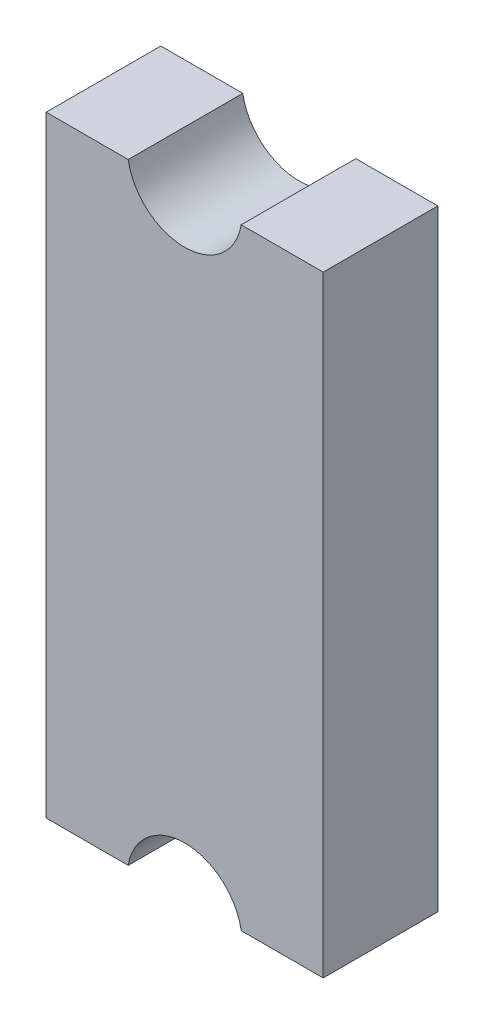
ISO-10303-21;
HEADER;
FILE_DESCRIPTION(('STEP AP214'),'2;1');
FILE_NAME('part.step','',(''),(''),'','','');
FILE_SCHEMA(('AUTOMOTIVE_DESIGN { 1 0 10303 214 1 1 1 1 }'));
ENDSEC;
DATA;
#1=APPLICATION_CONTEXT('core data for automotive mechanical design processes');
#2=APPLICATION_PROTOCOL_DEFINITION('international standard','automotive_design',2000,#1);
#3=PRODUCT_CONTEXT('',#1,'mechanical');
#4=PRODUCT('Part','Part','',(#3));
#5=PRODUCT_RELATED_PRODUCT_CATEGORY('part','',(#4));
#6=PRODUCT_DEFINITION_FORMATION('','',#4);
#7=PRODUCT_DEFINITION_CONTEXT('part definition',#1,'design');
#8=PRODUCT_DEFINITION('design','',#6,#7);
#9=PRODUCT_DEFINITION_SHAPE('','',#8);
#10=(LENGTH_UNIT() NAMED_UNIT(*) SI_UNIT(.MILLI.,.METRE.));
#11=(NAMED_UNIT(*) PLANE_ANGLE_UNIT() SI_UNIT($,.RADIAN.));
#12=(NAMED_UNIT(*) SI_UNIT($,.STERADIAN.) SOLID_ANGLE_UNIT());
#13=UNCERTAINTY_MEASURE_WITH_UNIT(LENGTH_MEASURE(1.E-05),#10,'distance_accuracy_value','');
#14=(GEOMETRIC_REPRESENTATION_CONTEXT(3) GLOBAL_UNCERTAINTY_ASSIGNED_CONTEXT((#13)) GLOBAL_UNIT_ASSIGNED_CONTEXT((#10,
#11,#12)) REPRESENTATION_CONTEXT('',''));
#15=CARTESIAN_POINT('',(0.,0.,0.));
#16=DIRECTION('',(0.,0.,1.));
#17=DIRECTION('',(1.,0.,0.));
#18=AXIS2_PLACEMENT_3D('',#15,#16,#17);
#19=CARTESIAN_POINT('',(-0.00667937524977396,-0.771801987569789,0.412208026250708));
#20=DIRECTION('',(0.,0.,1.));
#21=DIRECTION('',(1.,0.,0.));
#22=AXIS2_PLACEMENT_3D('',#19,#20,#21);
#23=PLANE('',#22);
#24=DIRECTION('',(0.,-1.,0.));
#25=VECTOR('',#24,1.);
#26=CARTESIAN_POINT('',(-0.459804375249889,-0.771801987569789,0.412208026250708));
#27=LINE('',#26,#25);
#28=CARTESIAN_POINT('',(-0.459804375249889,0.228198012430198,0.412208026250708));
#29=VERTEX_POINT('',#28);
#30=CARTESIAN_POINT('',(-0.459804375249822,-1.77180198756978,0.412208026250708));
#31=VERTEX_POINT('',#30);
#32=EDGE_CURVE('E11',#29,#31,#27,.T.);
#33=ORIENTED_EDGE('',*,*,#32,.T.);
#34=DIRECTION('',(1.,0.,0.));
#35=VECTOR('',#34,1.);
#36=CARTESIAN_POINT('',(-0.00667937524977396,-1.77180198756978,0.412208026250708));
#37=LINE('',#36,#35);
#38=CARTESIAN_POINT('',(-0.19155686847158,-1.77180198756976,0.412208026250708));
#39=VERTEX_POINT('',#38);
#40=EDGE_CURVE('E24',#31,#39,#37,.T.);
#41=ORIENTED_EDGE('',*,*,#40,.T.);
#42=CARTESIAN_POINT('',(-0.0066793752496696,-1.80305198756974,0.412208026250708));
#43=DIRECTION('',(0.,0.,-1.));
#44=DIRECTION('',(1.,0.,0.));
#45=AXIS2_PLACEMENT_3D('',#42,#43,#44);
#46=CIRCLE('',#45,0.187500000000043);
#47=CARTESIAN_POINT('',(0.178198117972232,-1.77180198756971,0.412208026250708));
#48=VERTEX_POINT('',#47);
#49=EDGE_CURVE('E141',#39,#48,#46,.T.);
#50=ORIENTED_EDGE('',*,*,#49,.T.);
#51=DIRECTION('',(1.,0.,0.));
#52=VECTOR('',#51,1.);
#53=CARTESIAN_POINT('',(-0.00667937524977396,-1.77180198756971,0.412208026250708));
#54=LINE('',#53,#52);
#55=CARTESIAN_POINT('',(0.446445624750341,-1.7718019875697,0.412208026250708));
#56=VERTEX_POINT('',#55);
#57=EDGE_CURVE('E83',#48,#56,#54,.T.);
#58=ORIENTED_EDGE('',*,*,#57,.T.);
#59=DIRECTION('',(0.,1.,0.));
#60=VECTOR('',#59,1.);
#61=CARTESIAN_POINT('',(0.446445624750342,-0.771801987569789,0.412208026250708));
#62=LINE('',#61,#60);
#63=CARTESIAN_POINT('',(0.446445624750274,0.228198012430271,0.412208026250708));
#64=VERTEX_POINT('',#63);
#65=EDGE_CURVE('E138',#56,#64,#62,.T.);
#66=ORIENTED_EDGE('',*,*,#65,.T.);
#67=DIRECTION('',(-1.,0.,0.));
#68=VECTOR('',#67,1.);
#69=CARTESIAN_POINT('',(-0.00667937524977396,0.228198012430271,0.412208026250708));
#70=LINE('',#69,#68);
#71=CARTESIAN_POINT('',(0.178198117972032,0.228198012430258,0.412208026250708));
#72=VERTEX_POINT('',#71);
#73=EDGE_CURVE('E136',#64,#72,#70,.T.);
#74=ORIENTED_EDGE('',*,*,#73,.T.);
#75=CARTESIAN_POINT('',(-0.00667937524987831,0.259448012430233,0.412208026250708));
#76=DIRECTION('',(0.,0.,-1.));
#77=DIRECTION('',(-1.,0.,0.));
#78=AXIS2_PLACEMENT_3D('',#75,#76,#77);
#79=CIRCLE('',#78,0.187500000000043);
#80=CARTESIAN_POINT('',(-0.19155686847178,0.228198012430207,0.412208026250708));
#81=VERTEX_POINT('',#80);
#82=EDGE_CURVE('E134',#72,#81,#79,.T.);
#83=ORIENTED_EDGE('',*,*,#82,.T.);
#84=DIRECTION('',(-1.,0.,0.));
#85=VECTOR('',#84,1.);
#86=CARTESIAN_POINT('',(-0.00667937524977396,0.228198012430207,0.412208026250708));
#87=LINE('',#86,#85);
#88=EDGE_CURVE('E132',#81,#29,#87,.T.);
#89=ORIENTED_EDGE('',*,*,#88,.T.);
#90=EDGE_LOOP('',(#33,#41,#50,#58,#66,#74,#83,#89));
#91=FACE_BOUND('',#90,.T.);
#92=ADVANCED_FACE('F17',(#91),#23,.T.);
#93=CARTESIAN_POINT('',(0.446445624750342,-1.77180198756969,0.0372080262507079));
#94=DIRECTION('',(1.01196828694583E-13,-1.,0.));
#95=DIRECTION('',(1.,1.01196828694583E-13,0.));
#96=AXIS2_PLACEMENT_3D('',#93,#94,#95);
#97=PLANE('',#96);
#98=DIRECTION('',(0.,0.,1.));
#99=VECTOR('',#98,1.);
#100=CARTESIAN_POINT('',(-0.191556868471578,-1.77180198756975,0.0372080262507079));
#101=LINE('',#100,#99);
#102=CARTESIAN_POINT('',(-0.19155686847158,-1.77180198756976,0.0372080262507079));
#103=VERTEX_POINT('',#102);
#104=EDGE_CURVE('E101',#103,#39,#101,.T.);
#105=ORIENTED_EDGE('',*,*,#104,.T.);
#106=ORIENTED_EDGE('',*,*,#40,.F.);
#107=DIRECTION('',(0.,0.,-1.));
#108=VECTOR('',#107,1.);
#109=CARTESIAN_POINT('',(-0.459804375249687,-1.77180198756978,0.0372080262507079));
#110=LINE('',#109,#108);
#111=CARTESIAN_POINT('',(-0.459804375249754,-1.77180198756978,0.0372080262507079));
#112=VERTEX_POINT('',#111);
#113=EDGE_CURVE('E129',#31,#112,#110,.T.);
#114=ORIENTED_EDGE('',*,*,#113,.T.);
#115=DIRECTION('',(1.,0.,0.));
#116=VECTOR('',#115,1.);
#117=CARTESIAN_POINT('',(-0.00667937524977396,-1.77180198756978,0.0372080262507079));
#118=LINE('',#117,#116);
#119=EDGE_CURVE('E127',#112,#103,#118,.T.);
#120=ORIENTED_EDGE('',*,*,#119,.T.);
#121=EDGE_LOOP('',(#105,#106,#114,#120));
#122=FACE_BOUND('',#121,.T.);
#123=ADVANCED_FACE('F143',(#122),#97,.T.);
#124=CARTESIAN_POINT('',(-0.459804375249889,0.22819801243018,0.0372080262507079));
#125=DIRECTION('',(-1.,-1.01196828694583E-13,0.));
#126=DIRECTION('',(1.01196828694583E-13,-1.,0.));
#127=AXIS2_PLACEMENT_3D('',#124,#125,#126);
#128=PLANE('',#127);
#129=ORIENTED_EDGE('',*,*,#32,.F.);
#130=DIRECTION('',(0.,0.,-1.));
#131=VECTOR('',#130,1.);
#132=CARTESIAN_POINT('',(-0.459804375249889,0.22819801243018,0.0372080262507079));
#133=LINE('',#132,#131);
#134=CARTESIAN_POINT('',(-0.459804375249889,0.22819801243018,0.0372080262507079));
#135=VERTEX_POINT('',#134);
#136=EDGE_CURVE('E125',#29,#135,#133,.T.);
#137=ORIENTED_EDGE('',*,*,#136,.T.);
#138=DIRECTION('',(1.01196828694583E-13,-1.,0.));
#139=VECTOR('',#138,1.);
#140=CARTESIAN_POINT('',(-0.459804375249889,0.22819801243018,0.037208026250708));
#141=LINE('',#140,#139);
#142=EDGE_CURVE('E122',#135,#112,#141,.T.);
#143=ORIENTED_EDGE('',*,*,#142,.T.);
#144=ORIENTED_EDGE('',*,*,#113,.F.);
#145=EDGE_LOOP('',(#129,#137,#143,#144));
#146=FACE_BOUND('',#145,.T.);
#147=ADVANCED_FACE('F146',(#146),#128,.T.);
#148=CARTESIAN_POINT('',(0.446445624750139,0.228198012430271,0.0372080262507079));
#149=DIRECTION('',(-1.01196828694583E-13,1.,0.));
#150=DIRECTION('',(-1.,-1.01196828694583E-13,0.));
#151=AXIS2_PLACEMENT_3D('',#148,#149,#150);
#152=PLANE('',#151);
#153=DIRECTION('',(0.,0.,-1.));
#154=VECTOR('',#153,1.);
#155=CARTESIAN_POINT('',(-0.19155686847178,0.228198012430207,0.0372080262507079));
#156=LINE('',#155,#154);
#157=CARTESIAN_POINT('',(-0.19155686847178,0.228198012430207,0.0372080262507079));
#158=VERTEX_POINT('',#157);
#159=EDGE_CURVE('E120',#81,#158,#156,.T.);
#160=ORIENTED_EDGE('',*,*,#159,.T.);
#161=DIRECTION('',(-1.,-1.01196828694583E-13,0.));
#162=VECTOR('',#161,1.);
#163=CARTESIAN_POINT('',(0.446445624750139,0.228198012430271,0.0372080262507079));
#164=LINE('',#163,#162);
#165=EDGE_CURVE('E117',#158,#135,#164,.T.);
#166=ORIENTED_EDGE('',*,*,#165,.T.);
#167=ORIENTED_EDGE('',*,*,#136,.F.);
#168=ORIENTED_EDGE('',*,*,#88,.F.);
#169=EDGE_LOOP('',(#160,#166,#167,#168));
#170=FACE_BOUND('',#169,.T.);
#171=ADVANCED_FACE('F150',(#170),#152,.T.);
#172=CARTESIAN_POINT('',(-0.00667937524987831,0.259448012430233,-0.276759193103288));
#173=DIRECTION('',(0.,0.,-1.));
#174=DIRECTION('',(-1.,0.,0.));
#175=AXIS2_PLACEMENT_3D('',#172,#173,#174);
#176=CYLINDRICAL_SURFACE('',#175,0.187500000000043);
#177=ORIENTED_EDGE('',*,*,#159,.F.);
#178=ORIENTED_EDGE('',*,*,#82,.F.);
#179=DIRECTION('',(0.,0.,1.));
#180=VECTOR('',#179,1.);
#181=CARTESIAN_POINT('',(0.17819811797203,0.228198012430244,-0.276759193103288));
#182=LINE('',#181,#180);
#183=CARTESIAN_POINT('',(0.17819811797203,0.228198012430244,0.0372080262507079));
#184=VERTEX_POINT('',#183);
#185=EDGE_CURVE('E114',#184,#72,#182,.T.);
#186=ORIENTED_EDGE('',*,*,#185,.F.);
#187=CARTESIAN_POINT('',(-0.00667937524987831,0.259448012430233,0.0372080262507079));
#188=DIRECTION('',(0.,0.,1.));
#189=DIRECTION('',(-1.,0.,0.));
#190=AXIS2_PLACEMENT_3D('',#187,#188,#189);
#191=CIRCLE('',#190,0.187500000000043);
#192=EDGE_CURVE('E112',#158,#184,#191,.T.);
#193=ORIENTED_EDGE('',*,*,#192,.F.);
#194=EDGE_LOOP('',(#177,#178,#186,#193));
#195=FACE_BOUND('',#194,.T.);
#196=ADVANCED_FACE('F155',(#195),#176,.F.);
#197=CARTESIAN_POINT('',(0.446445624750139,0.228198012430271,0.0372080262507079));
#198=DIRECTION('',(-1.01196828694583E-13,1.,0.));
#199=DIRECTION('',(-1.,-1.01196828694583E-13,0.));
#200=AXIS2_PLACEMENT_3D('',#197,#198,#199);
#201=PLANE('',#200);
#202=ORIENTED_EDGE('',*,*,#185,.T.);
#203=ORIENTED_EDGE('',*,*,#73,.F.);
#204=DIRECTION('',(0.,0.,-1.));
#205=VECTOR('',#204,1.);
#206=CARTESIAN_POINT('',(0.446445624750139,0.228198012430271,0.0372080262507079));
#207=LINE('',#206,#205);
#208=CARTESIAN_POINT('',(0.446445624750139,0.228198012430271,0.037208026250708));
#209=VERTEX_POINT('',#208);
#210=EDGE_CURVE('E110',#64,#209,#207,.T.);
#211=ORIENTED_EDGE('',*,*,#210,.T.);
#212=DIRECTION('',(-1.,-1.01196828694583E-13,0.));
#213=VECTOR('',#212,1.);
#214=CARTESIAN_POINT('',(0.446445624750139,0.228198012430271,0.037208026250708));
#215=LINE('',#214,#213);
#216=EDGE_CURVE('E107',#209,#184,#215,.T.);
#217=ORIENTED_EDGE('',*,*,#216,.T.);
#218=EDGE_LOOP('',(#202,#203,#211,#217));
#219=FACE_BOUND('',#218,.T.);
#220=ADVANCED_FACE('F159',(#219),#201,.T.);
#221=CARTESIAN_POINT('',(0.446445624750342,-1.77180198756972,0.0372080262507079));
#222=DIRECTION('',(1.,1.01196828694583E-13,0.));
#223=DIRECTION('',(-1.01196828694583E-13,1.,0.));
#224=AXIS2_PLACEMENT_3D('',#221,#222,#223);
#225=PLANE('',#224);
#226=DIRECTION('',(-1.01196828694583E-13,1.,0.));
#227=VECTOR('',#226,1.);
#228=CARTESIAN_POINT('',(0.446445624750342,-1.77180198756972,0.037208026250708));
#229=LINE('',#228,#227);
#230=CARTESIAN_POINT('',(0.446445624750341,-1.77180198756969,0.0372080262507079));
#231=VERTEX_POINT('',#230);
#232=EDGE_CURVE('E96',#231,#209,#229,.T.);
#233=ORIENTED_EDGE('',*,*,#232,.T.);
#234=ORIENTED_EDGE('',*,*,#210,.F.);
#235=ORIENTED_EDGE('',*,*,#65,.F.);
#236=DIRECTION('',(0.,0.,-1.));
#237=VECTOR('',#236,1.);
#238=CARTESIAN_POINT('',(0.446445624750342,-1.77180198756969,0.0372080262507079));
#239=LINE('',#238,#237);
#240=EDGE_CURVE('E87',#56,#231,#239,.T.);
#241=ORIENTED_EDGE('',*,*,#240,.T.);
#242=EDGE_LOOP('',(#233,#234,#235,#241));
#243=FACE_BOUND('',#242,.T.);
#244=ADVANCED_FACE('F162',(#243),#225,.T.);
#245=CARTESIAN_POINT('',(0.446445624750342,-1.77180198756969,0.0372080262507079));
#246=DIRECTION('',(1.01196828694583E-13,-1.,0.));
#247=DIRECTION('',(1.,1.01196828694583E-13,0.));
#248=AXIS2_PLACEMENT_3D('',#245,#246,#247);
#249=PLANE('',#248);
#250=DIRECTION('',(0.,0.,-1.));
#251=VECTOR('',#250,1.);
#252=CARTESIAN_POINT('',(0.178198117972232,-1.77180198756971,0.0372080262507079));
#253=LINE('',#252,#251);
#254=CARTESIAN_POINT('',(0.178198117972232,-1.77180198756971,0.0372080262507079));
#255=VERTEX_POINT('',#254);
#256=EDGE_CURVE('E78',#48,#255,#253,.T.);
#257=ORIENTED_EDGE('',*,*,#256,.T.);
#258=DIRECTION('',(1.,1.01196828694583E-13,0.));
#259=VECTOR('',#258,1.);
#260=CARTESIAN_POINT('',(0.446445624750342,-1.77180198756969,0.0372080262507079));
#261=LINE('',#260,#259);
#262=EDGE_CURVE('E82',#255,#231,#261,.T.);
#263=ORIENTED_EDGE('',*,*,#262,.T.);
#264=ORIENTED_EDGE('',*,*,#240,.F.);
#265=ORIENTED_EDGE('',*,*,#57,.F.);
#266=EDGE_LOOP('',(#257,#263,#264,#265));
#267=FACE_BOUND('',#266,.T.);
#268=ADVANCED_FACE('F80',(#267),#249,.T.);
#269=CARTESIAN_POINT('',(-0.0066793752496696,-1.80305198756974,-0.276759193103288));
#270=DIRECTION('',(0.,0.,1.));
#271=DIRECTION('',(1.,0.,0.));
#272=AXIS2_PLACEMENT_3D('',#269,#270,#271);
#273=CYLINDRICAL_SURFACE('',#272,0.187500000000043);
#274=CARTESIAN_POINT('',(-0.0066793752496696,-1.80305198756974,0.0372080262507079));
#275=DIRECTION('',(0.,0.,1.));
#276=DIRECTION('',(1.,0.,0.));
#277=AXIS2_PLACEMENT_3D('',#274,#275,#276);
#278=CIRCLE('',#277,0.187500000000043);
#279=EDGE_CURVE('E93',#255,#103,#278,.T.);
#280=ORIENTED_EDGE('',*,*,#279,.F.);
#281=ORIENTED_EDGE('',*,*,#256,.F.);
#282=ORIENTED_EDGE('',*,*,#49,.F.);
#283=ORIENTED_EDGE('',*,*,#104,.F.);
#284=EDGE_LOOP('',(#280,#281,#282,#283));
#285=FACE_BOUND('',#284,.T.);
#286=ADVANCED_FACE('F99',(#285),#273,.F.);
#287=CARTESIAN_POINT('',(-0.00667937524977396,-0.771801987569789,0.0372080262507079));
#288=DIRECTION('',(0.,0.,1.));
#289=DIRECTION('',(1.,0.,0.));
#290=AXIS2_PLACEMENT_3D('',#287,#288,#289);
#291=PLANE('',#290);
#292=ORIENTED_EDGE('',*,*,#192,.T.);
#293=ORIENTED_EDGE('',*,*,#216,.F.);
#294=ORIENTED_EDGE('',*,*,#232,.F.);
#295=ORIENTED_EDGE('',*,*,#262,.F.);
#296=ORIENTED_EDGE('',*,*,#279,.T.);
#297=ORIENTED_EDGE('',*,*,#119,.F.);
#298=ORIENTED_EDGE('',*,*,#142,.F.);
#299=ORIENTED_EDGE('',*,*,#165,.F.);
#300=EDGE_LOOP('',(#292,#293,#294,#295,#296,#297,#298,#299));
#301=FACE_BOUND('',#300,.T.);
#302=ADVANCED_FACE('F91',(#301),#291,.F.);
#303=CLOSED_SHELL('',(#92,#123,#147,#171,#196,#220,#244,#268,#286,#302));
#304=MANIFOLD_SOLID_BREP('B1',#303);
#305=ADVANCED_BREP_SHAPE_REPRESENTATION('',(#18,#304),#14);
#306=SHAPE_DEFINITION_REPRESENTATION(#9,#305);
ENDSEC;
END-ISO-10303-21;
